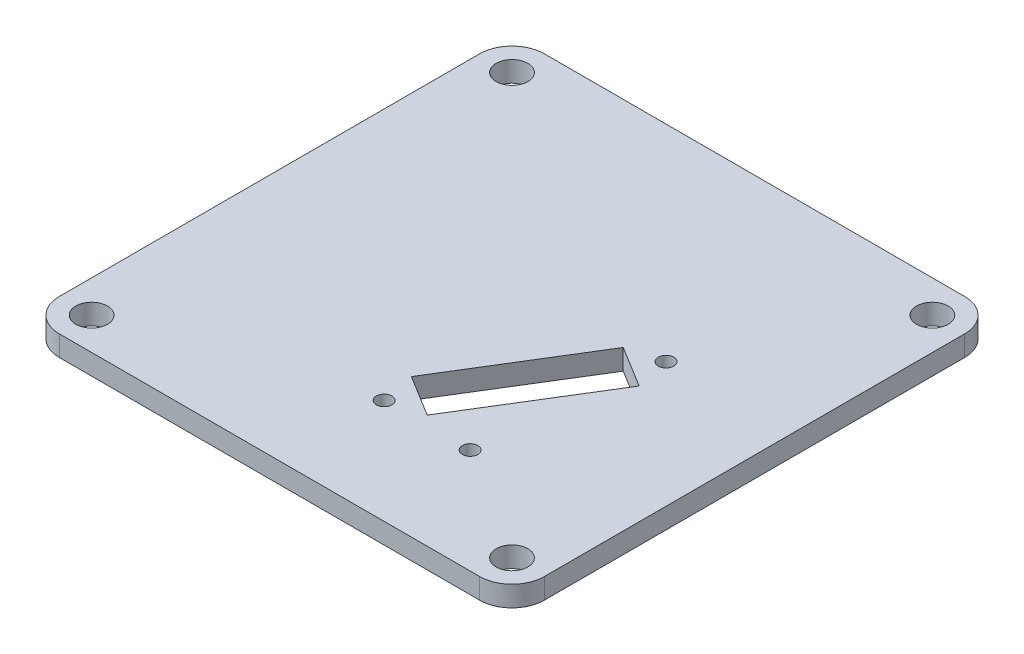
ISO-10303-21;
HEADER;
FILE_DESCRIPTION(('STEP AP214'),'2;1');
FILE_NAME('part.step','',(''),(''),'','','');
FILE_SCHEMA(('AUTOMOTIVE_DESIGN { 1 0 10303 214 1 1 1 1 }'));
ENDSEC;
DATA;
#1=APPLICATION_CONTEXT('core data for automotive mechanical design processes');
#2=APPLICATION_PROTOCOL_DEFINITION('international standard','automotive_design',2000,#1);
#3=PRODUCT_CONTEXT('',#1,'mechanical');
#4=PRODUCT('Part','Part','',(#3));
#5=PRODUCT_RELATED_PRODUCT_CATEGORY('part','',(#4));
#6=PRODUCT_DEFINITION_FORMATION('','',#4);
#7=PRODUCT_DEFINITION_CONTEXT('part definition',#1,'design');
#8=PRODUCT_DEFINITION('design','',#6,#7);
#9=PRODUCT_DEFINITION_SHAPE('','',#8);
#10=(LENGTH_UNIT() NAMED_UNIT(*) SI_UNIT(.MILLI.,.METRE.));
#11=(NAMED_UNIT(*) PLANE_ANGLE_UNIT() SI_UNIT($,.RADIAN.));
#12=(NAMED_UNIT(*) SI_UNIT($,.STERADIAN.) SOLID_ANGLE_UNIT());
#13=UNCERTAINTY_MEASURE_WITH_UNIT(LENGTH_MEASURE(1.E-05),#10,'distance_accuracy_value','');
#14=(GEOMETRIC_REPRESENTATION_CONTEXT(3) GLOBAL_UNCERTAINTY_ASSIGNED_CONTEXT((#13)) GLOBAL_UNIT_ASSIGNED_CONTEXT((#10,
#11,#12)) REPRESENTATION_CONTEXT('',''));
#15=CARTESIAN_POINT('',(0.,0.,0.));
#16=DIRECTION('',(0.,0.,1.));
#17=DIRECTION('',(1.,0.,0.));
#18=AXIS2_PLACEMENT_3D('',#15,#16,#17);
#19=CARTESIAN_POINT('',(140.,6.35,-10.));
#20=DIRECTION('',(0.,-1.,0.));
#21=DIRECTION('',(0.,0.,-1.));
#22=AXIS2_PLACEMENT_3D('',#19,#20,#21);
#23=CYLINDRICAL_SURFACE('',#22,10.);
#24=CARTESIAN_POINT('',(140.,0.,-10.));
#25=DIRECTION('',(0.,1.,0.));
#26=DIRECTION('',(0.,0.,1.));
#27=AXIS2_PLACEMENT_3D('',#24,#25,#26);
#28=CIRCLE('',#27,10.);
#29=CARTESIAN_POINT('',(140.,0.,0.));
#30=VERTEX_POINT('',#29);
#31=CARTESIAN_POINT('',(150.,0.,-10.));
#32=VERTEX_POINT('',#31);
#33=EDGE_CURVE('E209',#30,#32,#28,.T.);
#34=ORIENTED_EDGE('',*,*,#33,.T.);
#35=DIRECTION('',(0.,-1.,0.));
#36=VECTOR('',#35,1.);
#37=CARTESIAN_POINT('',(150.,6.35,-10.));
#38=LINE('',#37,#36);
#39=CARTESIAN_POINT('',(150.,6.35,-10.));
#40=VERTEX_POINT('',#39);
#41=EDGE_CURVE('E11',#40,#32,#38,.T.);
#42=ORIENTED_EDGE('',*,*,#41,.F.);
#43=CARTESIAN_POINT('',(140.,6.35,-10.));
#44=DIRECTION('',(0.,1.,0.));
#45=DIRECTION('',(0.,0.,1.));
#46=AXIS2_PLACEMENT_3D('',#43,#44,#45);
#47=CIRCLE('',#46,10.);
#48=CARTESIAN_POINT('',(140.,6.35,0.));
#49=VERTEX_POINT('',#48);
#50=EDGE_CURVE('E213',#49,#40,#47,.T.);
#51=ORIENTED_EDGE('',*,*,#50,.F.);
#52=DIRECTION('',(0.,-1.,0.));
#53=VECTOR('',#52,1.);
#54=CARTESIAN_POINT('',(140.,6.35,0.));
#55=LINE('',#54,#53);
#56=EDGE_CURVE('E239',#49,#30,#55,.T.);
#57=ORIENTED_EDGE('',*,*,#56,.T.);
#58=EDGE_LOOP('',(#34,#42,#51,#57));
#59=FACE_BOUND('',#58,.T.);
#60=ADVANCED_FACE('F39',(#59),#23,.T.);
#61=CARTESIAN_POINT('',(150.,6.35,-10.));
#62=DIRECTION('',(-1.,0.,0.));
#63=DIRECTION('',(0.,0.,1.));
#64=AXIS2_PLACEMENT_3D('',#61,#62,#63);
#65=PLANE('',#64);
#66=DIRECTION('',(0.,0.,-1.));
#67=VECTOR('',#66,1.);
#68=CARTESIAN_POINT('',(150.,0.,-10.));
#69=LINE('',#68,#67);
#70=CARTESIAN_POINT('',(150.,0.,-140.));
#71=VERTEX_POINT('',#70);
#72=EDGE_CURVE('E243',#32,#71,#69,.T.);
#73=ORIENTED_EDGE('',*,*,#72,.T.);
#74=DIRECTION('',(0.,-1.,0.));
#75=VECTOR('',#74,1.);
#76=CARTESIAN_POINT('',(150.,6.35,-140.));
#77=LINE('',#76,#75);
#78=CARTESIAN_POINT('',(150.,6.35,-140.));
#79=VERTEX_POINT('',#78);
#80=EDGE_CURVE('E47',#79,#71,#77,.T.);
#81=ORIENTED_EDGE('',*,*,#80,.F.);
#82=DIRECTION('',(0.,0.,-1.));
#83=VECTOR('',#82,1.);
#84=CARTESIAN_POINT('',(150.,6.35,-10.));
#85=LINE('',#84,#83);
#86=EDGE_CURVE('E217',#40,#79,#85,.T.);
#87=ORIENTED_EDGE('',*,*,#86,.F.);
#88=ORIENTED_EDGE('',*,*,#41,.T.);
#89=EDGE_LOOP('',(#73,#81,#87,#88));
#90=FACE_BOUND('',#89,.T.);
#91=ADVANCED_FACE('F313',(#90),#65,.F.);
#92=CARTESIAN_POINT('',(140.,6.35,-140.));
#93=DIRECTION('',(0.,-1.,0.));
#94=DIRECTION('',(0.,0.,-1.));
#95=AXIS2_PLACEMENT_3D('',#92,#93,#94);
#96=CYLINDRICAL_SURFACE('',#95,9.99999999999999);
#97=CARTESIAN_POINT('',(140.,0.,-140.));
#98=DIRECTION('',(0.,1.,0.));
#99=DIRECTION('',(0.,0.,-1.));
#100=AXIS2_PLACEMENT_3D('',#97,#98,#99);
#101=CIRCLE('',#100,9.99999999999999);
#102=CARTESIAN_POINT('',(140.,0.,-150.));
#103=VERTEX_POINT('',#102);
#104=EDGE_CURVE('E246',#71,#103,#101,.T.);
#105=ORIENTED_EDGE('',*,*,#104,.T.);
#106=DIRECTION('',(0.,-1.,0.));
#107=VECTOR('',#106,1.);
#108=CARTESIAN_POINT('',(140.,6.35,-150.));
#109=LINE('',#108,#107);
#110=CARTESIAN_POINT('',(140.,6.35,-150.));
#111=VERTEX_POINT('',#110);
#112=EDGE_CURVE('E282',#111,#103,#109,.T.);
#113=ORIENTED_EDGE('',*,*,#112,.F.);
#114=CARTESIAN_POINT('',(140.,6.35,-140.));
#115=DIRECTION('',(0.,1.,0.));
#116=DIRECTION('',(0.,0.,-1.));
#117=AXIS2_PLACEMENT_3D('',#114,#115,#116);
#118=CIRCLE('',#117,9.99999999999999);
#119=EDGE_CURVE('E221',#79,#111,#118,.T.);
#120=ORIENTED_EDGE('',*,*,#119,.F.);
#121=ORIENTED_EDGE('',*,*,#80,.T.);
#122=EDGE_LOOP('',(#105,#113,#120,#121));
#123=FACE_BOUND('',#122,.T.);
#124=ADVANCED_FACE('F291',(#123),#96,.T.);
#125=CARTESIAN_POINT('',(10.,6.35,-150.));
#126=DIRECTION('',(0.,0.,1.));
#127=DIRECTION('',(1.,0.,0.));
#128=AXIS2_PLACEMENT_3D('',#125,#126,#127);
#129=PLANE('',#128);
#130=DIRECTION('',(-1.,0.,0.));
#131=VECTOR('',#130,1.);
#132=CARTESIAN_POINT('',(10.,0.,-150.));
#133=LINE('',#132,#131);
#134=CARTESIAN_POINT('',(10.,0.,-150.));
#135=VERTEX_POINT('',#134);
#136=EDGE_CURVE('E249',#103,#135,#133,.T.);
#137=ORIENTED_EDGE('',*,*,#136,.T.);
#138=DIRECTION('',(0.,-1.,0.));
#139=VECTOR('',#138,1.);
#140=CARTESIAN_POINT('',(10.,6.35,-150.));
#141=LINE('',#140,#139);
#142=CARTESIAN_POINT('',(10.,6.35,-150.));
#143=VERTEX_POINT('',#142);
#144=EDGE_CURVE('E278',#143,#135,#141,.T.);
#145=ORIENTED_EDGE('',*,*,#144,.F.);
#146=DIRECTION('',(-1.,0.,0.));
#147=VECTOR('',#146,1.);
#148=CARTESIAN_POINT('',(10.,6.35,-150.));
#149=LINE('',#148,#147);
#150=EDGE_CURVE('E224',#111,#143,#149,.T.);
#151=ORIENTED_EDGE('',*,*,#150,.F.);
#152=ORIENTED_EDGE('',*,*,#112,.T.);
#153=EDGE_LOOP('',(#137,#145,#151,#152));
#154=FACE_BOUND('',#153,.T.);
#155=ADVANCED_FACE('F301',(#154),#129,.F.);
#156=CARTESIAN_POINT('',(10.,6.35,-140.));
#157=DIRECTION('',(0.,-1.,0.));
#158=DIRECTION('',(0.,0.,-1.));
#159=AXIS2_PLACEMENT_3D('',#156,#157,#158);
#160=CYLINDRICAL_SURFACE('',#159,10.);
#161=CARTESIAN_POINT('',(10.,0.,-140.));
#162=DIRECTION('',(0.,1.,0.));
#163=DIRECTION('',(0.,0.,-1.));
#164=AXIS2_PLACEMENT_3D('',#161,#162,#163);
#165=CIRCLE('',#164,10.);
#166=CARTESIAN_POINT('',(0.,0.,-140.));
#167=VERTEX_POINT('',#166);
#168=EDGE_CURVE('E252',#135,#167,#165,.T.);
#169=ORIENTED_EDGE('',*,*,#168,.T.);
#170=DIRECTION('',(0.,-1.,0.));
#171=VECTOR('',#170,1.);
#172=CARTESIAN_POINT('',(0.,6.35,-140.));
#173=LINE('',#172,#171);
#174=CARTESIAN_POINT('',(0.,6.35,-140.));
#175=VERTEX_POINT('',#174);
#176=EDGE_CURVE('E274',#175,#167,#173,.T.);
#177=ORIENTED_EDGE('',*,*,#176,.F.);
#178=CARTESIAN_POINT('',(10.,6.35,-140.));
#179=DIRECTION('',(0.,1.,0.));
#180=DIRECTION('',(0.,0.,-1.));
#181=AXIS2_PLACEMENT_3D('',#178,#179,#180);
#182=CIRCLE('',#181,10.);
#183=EDGE_CURVE('E227',#143,#175,#182,.T.);
#184=ORIENTED_EDGE('',*,*,#183,.F.);
#185=ORIENTED_EDGE('',*,*,#144,.T.);
#186=EDGE_LOOP('',(#169,#177,#184,#185));
#187=FACE_BOUND('',#186,.T.);
#188=ADVANCED_FACE('F305',(#187),#160,.T.);
#189=CARTESIAN_POINT('',(0.,6.35,-10.0000000000001));
#190=DIRECTION('',(1.,0.,0.));
#191=DIRECTION('',(0.,0.,-1.));
#192=AXIS2_PLACEMENT_3D('',#189,#190,#191);
#193=PLANE('',#192);
#194=DIRECTION('',(0.,0.,1.));
#195=VECTOR('',#194,1.);
#196=CARTESIAN_POINT('',(0.,0.,-10.0000000000001));
#197=LINE('',#196,#195);
#198=CARTESIAN_POINT('',(0.,0.,-10.0000000000001));
#199=VERTEX_POINT('',#198);
#200=EDGE_CURVE('E255',#167,#199,#197,.T.);
#201=ORIENTED_EDGE('',*,*,#200,.T.);
#202=DIRECTION('',(0.,-1.,0.));
#203=VECTOR('',#202,1.);
#204=CARTESIAN_POINT('',(0.,6.35,-10.0000000000001));
#205=LINE('',#204,#203);
#206=CARTESIAN_POINT('',(0.,6.35,-10.0000000000001));
#207=VERTEX_POINT('',#206);
#208=EDGE_CURVE('E270',#207,#199,#205,.T.);
#209=ORIENTED_EDGE('',*,*,#208,.F.);
#210=DIRECTION('',(0.,0.,1.));
#211=VECTOR('',#210,1.);
#212=CARTESIAN_POINT('',(0.,6.35,-10.0000000000001));
#213=LINE('',#212,#211);
#214=EDGE_CURVE('E230',#175,#207,#213,.T.);
#215=ORIENTED_EDGE('',*,*,#214,.F.);
#216=ORIENTED_EDGE('',*,*,#176,.T.);
#217=EDGE_LOOP('',(#201,#209,#215,#216));
#218=FACE_BOUND('',#217,.T.);
#219=ADVANCED_FACE('F326',(#218),#193,.F.);
#220=CARTESIAN_POINT('',(10.,6.35,-10.));
#221=DIRECTION('',(0.,-1.,0.));
#222=DIRECTION('',(0.,0.,-1.));
#223=AXIS2_PLACEMENT_3D('',#220,#221,#222);
#224=CYLINDRICAL_SURFACE('',#223,10.);
#225=CARTESIAN_POINT('',(10.,0.,-10.));
#226=DIRECTION('',(0.,1.,0.));
#227=DIRECTION('',(0.,0.,-1.));
#228=AXIS2_PLACEMENT_3D('',#225,#226,#227);
#229=CIRCLE('',#228,10.);
#230=CARTESIAN_POINT('',(10.0000000000001,0.,0.));
#231=VERTEX_POINT('',#230);
#232=EDGE_CURVE('E258',#199,#231,#229,.T.);
#233=ORIENTED_EDGE('',*,*,#232,.T.);
#234=DIRECTION('',(0.,-1.,0.));
#235=VECTOR('',#234,1.);
#236=CARTESIAN_POINT('',(10.0000000000001,6.35,0.));
#237=LINE('',#236,#235);
#238=CARTESIAN_POINT('',(10.0000000000001,6.35,0.));
#239=VERTEX_POINT('',#238);
#240=EDGE_CURVE('E266',#239,#231,#237,.T.);
#241=ORIENTED_EDGE('',*,*,#240,.F.);
#242=CARTESIAN_POINT('',(10.,6.35,-10.));
#243=DIRECTION('',(0.,1.,0.));
#244=DIRECTION('',(0.,0.,-1.));
#245=AXIS2_PLACEMENT_3D('',#242,#243,#244);
#246=CIRCLE('',#245,10.);
#247=EDGE_CURVE('E233',#207,#239,#246,.T.);
#248=ORIENTED_EDGE('',*,*,#247,.F.);
#249=ORIENTED_EDGE('',*,*,#208,.T.);
#250=EDGE_LOOP('',(#233,#241,#248,#249));
#251=FACE_BOUND('',#250,.T.);
#252=ADVANCED_FACE('F324',(#251),#224,.T.);
#253=CARTESIAN_POINT('',(10.0000000000001,6.35,0.));
#254=DIRECTION('',(0.,0.,-1.));
#255=DIRECTION('',(-1.,0.,0.));
#256=AXIS2_PLACEMENT_3D('',#253,#254,#255);
#257=PLANE('',#256);
#258=DIRECTION('',(1.,0.,0.));
#259=VECTOR('',#258,1.);
#260=CARTESIAN_POINT('',(10.0000000000001,0.,0.));
#261=LINE('',#260,#259);
#262=EDGE_CURVE('E218',#231,#30,#261,.T.);
#263=ORIENTED_EDGE('',*,*,#262,.T.);
#264=ORIENTED_EDGE('',*,*,#56,.F.);
#265=DIRECTION('',(1.,0.,0.));
#266=VECTOR('',#265,1.);
#267=CARTESIAN_POINT('',(10.0000000000001,6.35,0.));
#268=LINE('',#267,#266);
#269=EDGE_CURVE('E236',#239,#49,#268,.T.);
#270=ORIENTED_EDGE('',*,*,#269,.F.);
#271=ORIENTED_EDGE('',*,*,#240,.T.);
#272=EDGE_LOOP('',(#263,#264,#270,#271));
#273=FACE_BOUND('',#272,.T.);
#274=ADVANCED_FACE('F319',(#273),#257,.F.);
#275=CARTESIAN_POINT('',(140.,6.35,-10.));
#276=DIRECTION('',(0.,1.,0.));
#277=DIRECTION('',(0.,0.,1.));
#278=AXIS2_PLACEMENT_3D('',#275,#276,#277);
#279=PLANE('',#278);
#280=CARTESIAN_POINT('',(10.,6.35,-140.));
#281=DIRECTION('',(0.,1.,0.));
#282=DIRECTION('',(0.,0.,1.));
#283=AXIS2_PLACEMENT_3D('',#280,#281,#282);
#284=CIRCLE('',#283,4.9);
#285=CARTESIAN_POINT('',(10.,6.35,-135.1));
#286=VERTEX_POINT('',#285);
#287=EDGE_CURVE('E184',#286,#286,#284,.T.);
#288=ORIENTED_EDGE('',*,*,#287,.F.);
#289=EDGE_LOOP('',(#288));
#290=FACE_BOUND('',#289,.T.);
#291=DIRECTION('',(-0.524058667232841,0.,0.851682166831112));
#292=VECTOR('',#291,1.);
#293=CARTESIAN_POINT('',(75.8916168383912,6.35,-42.9833139258757));
#294=LINE('',#293,#292);
#295=CARTESIAN_POINT('',(100.852531158691,6.35,-83.5489355320415));
#296=VERTEX_POINT('',#295);
#297=CARTESIAN_POINT('',(75.8916168383912,6.35,-42.9833139258757));
#298=VERTEX_POINT('',#297);
#299=EDGE_CURVE('E54',#296,#298,#294,.T.);
#300=ORIENTED_EDGE('',*,*,#299,.F.);
#301=DIRECTION('',(-0.851682166831112,0.,-0.524058667232841));
#302=VECTOR('',#301,1.);
#303=CARTESIAN_POINT('',(113.627763661158,6.35,-75.6880555235489));
#304=LINE('',#303,#302);
#305=CARTESIAN_POINT('',(113.627763661158,6.35,-75.6880555235489));
#306=VERTEX_POINT('',#305);
#307=EDGE_CURVE('E149',#306,#296,#304,.T.);
#308=ORIENTED_EDGE('',*,*,#307,.F.);
#309=DIRECTION('',(0.524058667232842,0.,-0.851682166831112));
#310=VECTOR('',#309,1.);
#311=CARTESIAN_POINT('',(88.6668493408578,6.35,-35.122433917383));
#312=LINE('',#311,#310);
#313=CARTESIAN_POINT('',(88.6668493408578,6.35,-35.122433917383));
#314=VERTEX_POINT('',#313);
#315=EDGE_CURVE('E153',#314,#306,#312,.T.);
#316=ORIENTED_EDGE('',*,*,#315,.F.);
#317=DIRECTION('',(0.851682166831111,0.,0.524058667232843));
#318=VECTOR('',#317,1.);
#319=CARTESIAN_POINT('',(75.8916168383912,6.35,-42.9833139258757));
#320=LINE('',#319,#318);
#321=EDGE_CURVE('E165',#298,#314,#320,.T.);
#322=ORIENTED_EDGE('',*,*,#321,.F.);
#323=EDGE_LOOP('',(#300,#308,#316,#322));
#324=FACE_BOUND('',#323,.T.);
#325=CARTESIAN_POINT('',(111.276700611028,6.35,-86.3693816366452));
#326=DIRECTION('',(0.,1.,0.));
#327=DIRECTION('',(0.,0.,1.));
#328=AXIS2_PLACEMENT_3D('',#325,#326,#327);
#329=CIRCLE('',#328,2.4);
#330=CARTESIAN_POINT('',(111.276700611028,6.35,-83.9693816366452));
#331=VERTEX_POINT('',#330);
#332=EDGE_CURVE('E175',#331,#331,#329,.T.);
#333=ORIENTED_EDGE('',*,*,#332,.F.);
#334=EDGE_LOOP('',(#333));
#335=FACE_BOUND('',#334,.T.);
#336=CARTESIAN_POINT('',(78.0681595456267,6.35,-32.4));
#337=DIRECTION('',(0.,1.,0.));
#338=DIRECTION('',(0.,0.,1.));
#339=AXIS2_PLACEMENT_3D('',#336,#337,#338);
#340=CIRCLE('',#339,2.4);
#341=CARTESIAN_POINT('',(78.0681595456267,6.35,-30.));
#342=VERTEX_POINT('',#341);
#343=EDGE_CURVE('E194',#342,#342,#340,.T.);
#344=ORIENTED_EDGE('',*,*,#343,.F.);
#345=EDGE_LOOP('',(#344));
#346=FACE_BOUND('',#345,.T.);
#347=CARTESIAN_POINT('',(140.,6.35,-10.));
#348=DIRECTION('',(0.,1.,0.));
#349=DIRECTION('',(0.,0.,1.));
#350=AXIS2_PLACEMENT_3D('',#347,#348,#349);
#351=CIRCLE('',#350,4.9);
#352=CARTESIAN_POINT('',(140.,6.35,-5.10000000000001));
#353=VERTEX_POINT('',#352);
#354=EDGE_CURVE('E511',#353,#353,#351,.T.);
#355=ORIENTED_EDGE('',*,*,#354,.F.);
#356=EDGE_LOOP('',(#355));
#357=FACE_BOUND('',#356,.T.);
#358=CARTESIAN_POINT('',(140.,6.35,-140.));
#359=DIRECTION('',(0.,1.,0.));
#360=DIRECTION('',(0.,0.,1.));
#361=AXIS2_PLACEMENT_3D('',#358,#359,#360);
#362=CIRCLE('',#361,4.89999999999999);
#363=CARTESIAN_POINT('',(140.,6.35,-135.1));
#364=VERTEX_POINT('',#363);
#365=EDGE_CURVE('E156',#364,#364,#362,.T.);
#366=ORIENTED_EDGE('',*,*,#365,.F.);
#367=EDGE_LOOP('',(#366));
#368=FACE_BOUND('',#367,.T.);
#369=CARTESIAN_POINT('',(10.,6.35,-10.));
#370=DIRECTION('',(0.,1.,0.));
#371=DIRECTION('',(0.,0.,1.));
#372=AXIS2_PLACEMENT_3D('',#369,#370,#371);
#373=CIRCLE('',#372,4.9);
#374=CARTESIAN_POINT('',(10.,6.35,-5.10000000000001));
#375=VERTEX_POINT('',#374);
#376=EDGE_CURVE('E518',#375,#375,#373,.T.);
#377=ORIENTED_EDGE('',*,*,#376,.F.);
#378=EDGE_LOOP('',(#377));
#379=FACE_BOUND('',#378,.T.);
#380=CARTESIAN_POINT('',(104.650093784571,6.35,-32.4));
#381=DIRECTION('',(0.,1.,0.));
#382=DIRECTION('',(0.,0.,1.));
#383=AXIS2_PLACEMENT_3D('',#380,#381,#382);
#384=CIRCLE('',#383,2.4);
#385=CARTESIAN_POINT('',(104.650093784571,6.35,-30.));
#386=VERTEX_POINT('',#385);
#387=EDGE_CURVE('E193',#386,#386,#384,.T.);
#388=ORIENTED_EDGE('',*,*,#387,.F.);
#389=EDGE_LOOP('',(#388));
#390=FACE_BOUND('',#389,.T.);
#391=ORIENTED_EDGE('',*,*,#50,.T.);
#392=ORIENTED_EDGE('',*,*,#86,.T.);
#393=ORIENTED_EDGE('',*,*,#119,.T.);
#394=ORIENTED_EDGE('',*,*,#150,.T.);
#395=ORIENTED_EDGE('',*,*,#183,.T.);
#396=ORIENTED_EDGE('',*,*,#214,.T.);
#397=ORIENTED_EDGE('',*,*,#247,.T.);
#398=ORIENTED_EDGE('',*,*,#269,.T.);
#399=EDGE_LOOP('',(#391,#392,#393,#394,#395,#396,#397,#398));
#400=FACE_BOUND('',#399,.T.);
#401=ADVANCED_FACE('F309',(#290,#324,#335,#346,#357,#368,#379,#390,#400),#279,.T.);
#402=CARTESIAN_POINT('',(140.,0.,-10.));
#403=DIRECTION('',(0.,1.,0.));
#404=DIRECTION('',(0.,0.,1.));
#405=AXIS2_PLACEMENT_3D('',#402,#403,#404);
#406=PLANE('',#405);
#407=CARTESIAN_POINT('',(10.,0.,-140.));
#408=DIRECTION('',(0.,1.,0.));
#409=DIRECTION('',(0.,0.,1.));
#410=AXIS2_PLACEMENT_3D('',#407,#408,#409);
#411=CIRCLE('',#410,4.9);
#412=CARTESIAN_POINT('',(10.,0.,-135.1));
#413=VERTEX_POINT('',#412);
#414=EDGE_CURVE('E166',#413,#413,#411,.T.);
#415=ORIENTED_EDGE('',*,*,#414,.T.);
#416=EDGE_LOOP('',(#415));
#417=FACE_BOUND('',#416,.T.);
#418=DIRECTION('',(-0.851682166831112,0.,-0.524058667232841));
#419=VECTOR('',#418,1.);
#420=CARTESIAN_POINT('',(113.627763661158,0.,-75.6880555235489));
#421=LINE('',#420,#419);
#422=CARTESIAN_POINT('',(113.627763661158,0.,-75.6880555235489));
#423=VERTEX_POINT('',#422);
#424=CARTESIAN_POINT('',(100.852531158691,0.,-83.5489355320415));
#425=VERTEX_POINT('',#424);
#426=EDGE_CURVE('E137',#423,#425,#421,.T.);
#427=ORIENTED_EDGE('',*,*,#426,.T.);
#428=DIRECTION('',(-0.524058667232841,0.,0.851682166831112));
#429=VECTOR('',#428,1.);
#430=CARTESIAN_POINT('',(75.8916168383912,0.,-42.9833139258757));
#431=LINE('',#430,#429);
#432=CARTESIAN_POINT('',(75.8916168383912,0.,-42.9833139258757));
#433=VERTEX_POINT('',#432);
#434=EDGE_CURVE('E130',#425,#433,#431,.T.);
#435=ORIENTED_EDGE('',*,*,#434,.T.);
#436=DIRECTION('',(0.851682166831111,0.,0.524058667232843));
#437=VECTOR('',#436,1.);
#438=CARTESIAN_POINT('',(75.8916168383912,0.,-42.9833139258757));
#439=LINE('',#438,#437);
#440=CARTESIAN_POINT('',(88.6668493408578,0.,-35.122433917383));
#441=VERTEX_POINT('',#440);
#442=EDGE_CURVE('E140',#433,#441,#439,.T.);
#443=ORIENTED_EDGE('',*,*,#442,.T.);
#444=DIRECTION('',(0.524058667232842,0.,-0.851682166831112));
#445=VECTOR('',#444,1.);
#446=CARTESIAN_POINT('',(88.6668493408578,0.,-35.122433917383));
#447=LINE('',#446,#445);
#448=EDGE_CURVE('E62',#441,#423,#447,.T.);
#449=ORIENTED_EDGE('',*,*,#448,.T.);
#450=EDGE_LOOP('',(#427,#435,#443,#449));
#451=FACE_BOUND('',#450,.T.);
#452=CARTESIAN_POINT('',(111.276700611028,0.,-86.3693816366452));
#453=DIRECTION('',(0.,1.,0.));
#454=DIRECTION('',(0.,0.,1.));
#455=AXIS2_PLACEMENT_3D('',#452,#453,#454);
#456=CIRCLE('',#455,2.4);
#457=CARTESIAN_POINT('',(111.276700611028,0.,-83.9693816366452));
#458=VERTEX_POINT('',#457);
#459=EDGE_CURVE('E198',#458,#458,#456,.T.);
#460=ORIENTED_EDGE('',*,*,#459,.T.);
#461=EDGE_LOOP('',(#460));
#462=FACE_BOUND('',#461,.T.);
#463=CARTESIAN_POINT('',(78.0681595456267,0.,-32.4));
#464=DIRECTION('',(0.,1.,0.));
#465=DIRECTION('',(0.,0.,1.));
#466=AXIS2_PLACEMENT_3D('',#463,#464,#465);
#467=CIRCLE('',#466,2.4);
#468=CARTESIAN_POINT('',(78.0681595456267,0.,-30.));
#469=VERTEX_POINT('',#468);
#470=EDGE_CURVE('E189',#469,#469,#467,.T.);
#471=ORIENTED_EDGE('',*,*,#470,.T.);
#472=EDGE_LOOP('',(#471));
#473=FACE_BOUND('',#472,.T.);
#474=CARTESIAN_POINT('',(140.,0.,-10.));
#475=DIRECTION('',(0.,1.,0.));
#476=DIRECTION('',(0.,0.,1.));
#477=AXIS2_PLACEMENT_3D('',#474,#475,#476);
#478=CIRCLE('',#477,4.9);
#479=CARTESIAN_POINT('',(140.,0.,-5.10000000000001));
#480=VERTEX_POINT('',#479);
#481=EDGE_CURVE('E533',#480,#480,#478,.T.);
#482=ORIENTED_EDGE('',*,*,#481,.T.);
#483=EDGE_LOOP('',(#482));
#484=FACE_BOUND('',#483,.T.);
#485=CARTESIAN_POINT('',(140.,0.,-140.));
#486=DIRECTION('',(0.,1.,0.));
#487=DIRECTION('',(0.,0.,1.));
#488=AXIS2_PLACEMENT_3D('',#485,#486,#487);
#489=CIRCLE('',#488,4.89999999999999);
#490=CARTESIAN_POINT('',(140.,0.,-135.1));
#491=VERTEX_POINT('',#490);
#492=EDGE_CURVE('E523',#491,#491,#489,.T.);
#493=ORIENTED_EDGE('',*,*,#492,.T.);
#494=EDGE_LOOP('',(#493));
#495=FACE_BOUND('',#494,.T.);
#496=CARTESIAN_POINT('',(10.,0.,-10.));
#497=DIRECTION('',(0.,1.,0.));
#498=DIRECTION('',(0.,0.,1.));
#499=AXIS2_PLACEMENT_3D('',#496,#497,#498);
#500=CIRCLE('',#499,4.9);
#501=CARTESIAN_POINT('',(10.,0.,-5.10000000000001));
#502=VERTEX_POINT('',#501);
#503=EDGE_CURVE('E188',#502,#502,#500,.T.);
#504=ORIENTED_EDGE('',*,*,#503,.T.);
#505=EDGE_LOOP('',(#504));
#506=FACE_BOUND('',#505,.T.);
#507=CARTESIAN_POINT('',(104.650093784571,0.,-32.4));
#508=DIRECTION('',(0.,1.,0.));
#509=DIRECTION('',(0.,0.,1.));
#510=AXIS2_PLACEMENT_3D('',#507,#508,#509);
#511=CIRCLE('',#510,2.4);
#512=CARTESIAN_POINT('',(104.650093784571,0.,-30.));
#513=VERTEX_POINT('',#512);
#514=EDGE_CURVE('E205',#513,#513,#511,.T.);
#515=ORIENTED_EDGE('',*,*,#514,.T.);
#516=EDGE_LOOP('',(#515));
#517=FACE_BOUND('',#516,.T.);
#518=ORIENTED_EDGE('',*,*,#33,.F.);
#519=ORIENTED_EDGE('',*,*,#262,.F.);
#520=ORIENTED_EDGE('',*,*,#232,.F.);
#521=ORIENTED_EDGE('',*,*,#200,.F.);
#522=ORIENTED_EDGE('',*,*,#168,.F.);
#523=ORIENTED_EDGE('',*,*,#136,.F.);
#524=ORIENTED_EDGE('',*,*,#104,.F.);
#525=ORIENTED_EDGE('',*,*,#72,.F.);
#526=EDGE_LOOP('',(#518,#519,#520,#521,#522,#523,#524,#525));
#527=FACE_BOUND('',#526,.T.);
#528=ADVANCED_FACE('F145',(#417,#451,#462,#473,#484,#495,#506,#517,#527),#406,.F.);
#529=CARTESIAN_POINT('',(104.650093784571,0.,-32.4));
#530=DIRECTION('',(0.,1.,0.));
#531=DIRECTION('',(0.,0.,1.));
#532=AXIS2_PLACEMENT_3D('',#529,#530,#531);
#533=CYLINDRICAL_SURFACE('',#532,2.4);
#534=ORIENTED_EDGE('',*,*,#514,.F.);
#535=EDGE_LOOP('',(#534));
#536=FACE_BOUND('',#535,.T.);
#537=ORIENTED_EDGE('',*,*,#387,.T.);
#538=EDGE_LOOP('',(#537));
#539=FACE_BOUND('',#538,.T.);
#540=ADVANCED_FACE('F389',(#536,#539),#533,.F.);
#541=CARTESIAN_POINT('',(10.,0.,-10.));
#542=DIRECTION('',(0.,1.,0.));
#543=DIRECTION('',(0.,0.,1.));
#544=AXIS2_PLACEMENT_3D('',#541,#542,#543);
#545=CYLINDRICAL_SURFACE('',#544,4.9);
#546=ORIENTED_EDGE('',*,*,#503,.F.);
#547=EDGE_LOOP('',(#546));
#548=FACE_BOUND('',#547,.T.);
#549=ORIENTED_EDGE('',*,*,#376,.T.);
#550=EDGE_LOOP('',(#549));
#551=FACE_BOUND('',#550,.T.);
#552=ADVANCED_FACE('F399',(#548,#551),#545,.F.);
#553=CARTESIAN_POINT('',(140.,0.,-140.));
#554=DIRECTION('',(0.,1.,0.));
#555=DIRECTION('',(0.,0.,1.));
#556=AXIS2_PLACEMENT_3D('',#553,#554,#555);
#557=CYLINDRICAL_SURFACE('',#556,4.89999999999999);
#558=ORIENTED_EDGE('',*,*,#492,.F.);
#559=EDGE_LOOP('',(#558));
#560=FACE_BOUND('',#559,.T.);
#561=ORIENTED_EDGE('',*,*,#365,.T.);
#562=EDGE_LOOP('',(#561));
#563=FACE_BOUND('',#562,.T.);
#564=ADVANCED_FACE('F409',(#560,#563),#557,.F.);
#565=CARTESIAN_POINT('',(140.,0.,-10.));
#566=DIRECTION('',(0.,1.,0.));
#567=DIRECTION('',(0.,0.,1.));
#568=AXIS2_PLACEMENT_3D('',#565,#566,#567);
#569=CYLINDRICAL_SURFACE('',#568,4.9);
#570=ORIENTED_EDGE('',*,*,#481,.F.);
#571=EDGE_LOOP('',(#570));
#572=FACE_BOUND('',#571,.T.);
#573=ORIENTED_EDGE('',*,*,#354,.T.);
#574=EDGE_LOOP('',(#573));
#575=FACE_BOUND('',#574,.T.);
#576=ADVANCED_FACE('F419',(#572,#575),#569,.F.);
#577=CARTESIAN_POINT('',(78.0681595456267,0.,-32.4));
#578=DIRECTION('',(0.,1.,0.));
#579=DIRECTION('',(0.,0.,1.));
#580=AXIS2_PLACEMENT_3D('',#577,#578,#579);
#581=CYLINDRICAL_SURFACE('',#580,2.4);
#582=ORIENTED_EDGE('',*,*,#470,.F.);
#583=EDGE_LOOP('',(#582));
#584=FACE_BOUND('',#583,.T.);
#585=ORIENTED_EDGE('',*,*,#343,.T.);
#586=EDGE_LOOP('',(#585));
#587=FACE_BOUND('',#586,.T.);
#588=ADVANCED_FACE('F429',(#584,#587),#581,.F.);
#589=CARTESIAN_POINT('',(111.276700611028,0.,-86.3693816366452));
#590=DIRECTION('',(0.,1.,0.));
#591=DIRECTION('',(0.,0.,1.));
#592=AXIS2_PLACEMENT_3D('',#589,#590,#591);
#593=CYLINDRICAL_SURFACE('',#592,2.4);
#594=ORIENTED_EDGE('',*,*,#459,.F.);
#595=EDGE_LOOP('',(#594));
#596=FACE_BOUND('',#595,.T.);
#597=ORIENTED_EDGE('',*,*,#332,.T.);
#598=EDGE_LOOP('',(#597));
#599=FACE_BOUND('',#598,.T.);
#600=ADVANCED_FACE('F439',(#596,#599),#593,.F.);
#601=CARTESIAN_POINT('',(75.8916168383912,0.,-42.9833139258757));
#602=DIRECTION('',(-0.851682166831112,0.,-0.524058667232841));
#603=DIRECTION('',(-0.524058667232841,0.,0.851682166831112));
#604=AXIS2_PLACEMENT_3D('',#601,#602,#603);
#605=PLANE('',#604);
#606=ORIENTED_EDGE('',*,*,#299,.T.);
#607=DIRECTION('',(0.,1.,0.));
#608=VECTOR('',#607,1.);
#609=CARTESIAN_POINT('',(75.8916168383912,0.,-42.9833139258757));
#610=LINE('',#609,#608);
#611=EDGE_CURVE('E126',#433,#298,#610,.T.);
#612=ORIENTED_EDGE('',*,*,#611,.F.);
#613=ORIENTED_EDGE('',*,*,#434,.F.);
#614=DIRECTION('',(0.,1.,0.));
#615=VECTOR('',#614,1.);
#616=CARTESIAN_POINT('',(100.852531158691,0.,-83.5489355320415));
#617=LINE('',#616,#615);
#618=EDGE_CURVE('E172',#425,#296,#617,.T.);
#619=ORIENTED_EDGE('',*,*,#618,.T.);
#620=EDGE_LOOP('',(#606,#612,#613,#619));
#621=FACE_BOUND('',#620,.T.);
#622=ADVANCED_FACE('F128',(#621),#605,.F.);
#623=CARTESIAN_POINT('',(113.627763661158,0.,-75.6880555235489));
#624=DIRECTION('',(0.524058667232841,0.,-0.851682166831112));
#625=DIRECTION('',(-0.851682166831112,0.,-0.524058667232841));
#626=AXIS2_PLACEMENT_3D('',#623,#624,#625);
#627=PLANE('',#626);
#628=ORIENTED_EDGE('',*,*,#307,.T.);
#629=ORIENTED_EDGE('',*,*,#618,.F.);
#630=ORIENTED_EDGE('',*,*,#426,.F.);
#631=DIRECTION('',(0.,1.,0.));
#632=VECTOR('',#631,1.);
#633=CARTESIAN_POINT('',(113.627763661158,0.,-75.6880555235489));
#634=LINE('',#633,#632);
#635=EDGE_CURVE('E176',#423,#306,#634,.T.);
#636=ORIENTED_EDGE('',*,*,#635,.T.);
#637=EDGE_LOOP('',(#628,#629,#630,#636));
#638=FACE_BOUND('',#637,.T.);
#639=ADVANCED_FACE('F458',(#638),#627,.F.);
#640=CARTESIAN_POINT('',(88.6668493408578,0.,-35.122433917383));
#641=DIRECTION('',(0.851682166831112,0.,0.524058667232842));
#642=DIRECTION('',(0.524058667232842,0.,-0.851682166831112));
#643=AXIS2_PLACEMENT_3D('',#640,#641,#642);
#644=PLANE('',#643);
#645=ORIENTED_EDGE('',*,*,#315,.T.);
#646=ORIENTED_EDGE('',*,*,#635,.F.);
#647=ORIENTED_EDGE('',*,*,#448,.F.);
#648=DIRECTION('',(0.,1.,0.));
#649=VECTOR('',#648,1.);
#650=CARTESIAN_POINT('',(88.6668493408578,0.,-35.122433917383));
#651=LINE('',#650,#649);
#652=EDGE_CURVE('E136',#441,#314,#651,.T.);
#653=ORIENTED_EDGE('',*,*,#652,.T.);
#654=EDGE_LOOP('',(#645,#646,#647,#653));
#655=FACE_BOUND('',#654,.T.);
#656=ADVANCED_FACE('F467',(#655),#644,.F.);
#657=CARTESIAN_POINT('',(75.8916168383912,0.,-42.9833139258757));
#658=DIRECTION('',(-0.524058667232843,0.,0.851682166831111));
#659=DIRECTION('',(0.851682166831111,0.,0.524058667232843));
#660=AXIS2_PLACEMENT_3D('',#657,#658,#659);
#661=PLANE('',#660);
#662=ORIENTED_EDGE('',*,*,#321,.T.);
#663=ORIENTED_EDGE('',*,*,#652,.F.);
#664=ORIENTED_EDGE('',*,*,#442,.F.);
#665=ORIENTED_EDGE('',*,*,#611,.T.);
#666=EDGE_LOOP('',(#662,#663,#664,#665));
#667=FACE_BOUND('',#666,.T.);
#668=ADVANCED_FACE('F141',(#667),#661,.F.);
#669=CARTESIAN_POINT('',(10.,0.,-140.));
#670=DIRECTION('',(0.,1.,0.));
#671=DIRECTION('',(0.,0.,1.));
#672=AXIS2_PLACEMENT_3D('',#669,#670,#671);
#673=CYLINDRICAL_SURFACE('',#672,4.9);
#674=ORIENTED_EDGE('',*,*,#414,.F.);
#675=EDGE_LOOP('',(#674));
#676=FACE_BOUND('',#675,.T.);
#677=ORIENTED_EDGE('',*,*,#287,.T.);
#678=EDGE_LOOP('',(#677));
#679=FACE_BOUND('',#678,.T.);
#680=ADVANCED_FACE('F485',(#676,#679),#673,.F.);
#681=CLOSED_SHELL('',(#60,#91,#124,#155,#188,#219,#252,#274,#401,#528,#540,#552,#564,#576,#588,
#600,#622,#639,#656,#668,#680));
#682=MANIFOLD_SOLID_BREP('B2',#681);
#683=ADVANCED_BREP_SHAPE_REPRESENTATION('',(#18,#682),#14);
#684=SHAPE_DEFINITION_REPRESENTATION(#9,#683);
ENDSEC;
END-ISO-10303-21;
